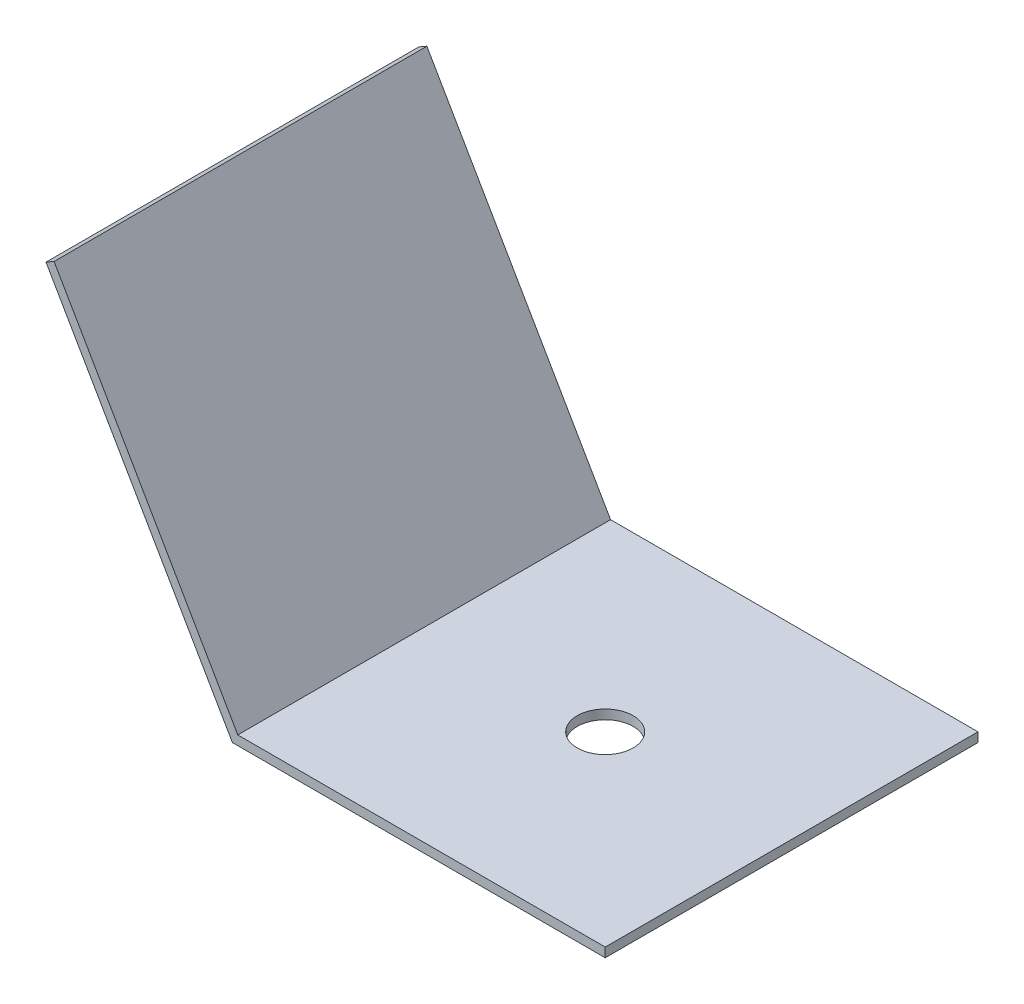
ISO-10303-21;
HEADER;
FILE_DESCRIPTION(('STEP AP214'),'2;1');
FILE_NAME('part.step','',(''),(''),'','','');
FILE_SCHEMA(('AUTOMOTIVE_DESIGN { 1 0 10303 214 1 1 1 1 }'));
ENDSEC;
DATA;
#1=APPLICATION_CONTEXT('core data for automotive mechanical design processes');
#2=APPLICATION_PROTOCOL_DEFINITION('international standard','automotive_design',2000,#1);
#3=PRODUCT_CONTEXT('',#1,'mechanical');
#4=PRODUCT('Part','Part','',(#3));
#5=PRODUCT_RELATED_PRODUCT_CATEGORY('part','',(#4));
#6=PRODUCT_DEFINITION_FORMATION('','',#4);
#7=PRODUCT_DEFINITION_CONTEXT('part definition',#1,'design');
#8=PRODUCT_DEFINITION('design','',#6,#7);
#9=PRODUCT_DEFINITION_SHAPE('','',#8);
#10=(LENGTH_UNIT() NAMED_UNIT(*) SI_UNIT(.MILLI.,.METRE.));
#11=(NAMED_UNIT(*) PLANE_ANGLE_UNIT() SI_UNIT($,.RADIAN.));
#12=(NAMED_UNIT(*) SI_UNIT($,.STERADIAN.) SOLID_ANGLE_UNIT());
#13=UNCERTAINTY_MEASURE_WITH_UNIT(LENGTH_MEASURE(1.E-05),#10,'distance_accuracy_value','');
#14=(GEOMETRIC_REPRESENTATION_CONTEXT(3) GLOBAL_UNCERTAINTY_ASSIGNED_CONTEXT((#13)) GLOBAL_UNIT_ASSIGNED_CONTEXT((#10,
#11,#12)) REPRESENTATION_CONTEXT('',''));
#15=CARTESIAN_POINT('',(0.,0.,0.));
#16=DIRECTION('',(0.,0.,1.));
#17=DIRECTION('',(1.,0.,0.));
#18=AXIS2_PLACEMENT_3D('',#15,#16,#17);
#19=CARTESIAN_POINT('',(0.,1.,0.));
#20=DIRECTION('',(0.,-1.,0.));
#21=DIRECTION('',(0.,0.,-1.));
#22=AXIS2_PLACEMENT_3D('',#19,#20,#21);
#23=PLANE('',#22);
#24=CARTESIAN_POINT('',(0.,1.,0.));
#25=DIRECTION('',(0.,1.,0.));
#26=DIRECTION('',(0.,0.,1.));
#27=AXIS2_PLACEMENT_3D('',#24,#25,#26);
#28=CIRCLE('',#27,3.);
#29=CARTESIAN_POINT('',(0.,1.,3.));
#30=VERTEX_POINT('',#29);
#31=EDGE_CURVE('E116',#30,#30,#28,.T.);
#32=ORIENTED_EDGE('',*,*,#31,.F.);
#33=EDGE_LOOP('',(#32));
#34=FACE_BOUND('',#33,.T.);
#35=DIRECTION('',(0.,0.,-1.));
#36=VECTOR('',#35,1.);
#37=CARTESIAN_POINT('',(-19.4226497308104,1.,0.));
#38=LINE('',#37,#36);
#39=CARTESIAN_POINT('',(-19.4226497308104,1.,20.));
#40=VERTEX_POINT('',#39);
#41=CARTESIAN_POINT('',(-19.4226497308104,1.,-20.));
#42=VERTEX_POINT('',#41);
#43=EDGE_CURVE('E52',#40,#42,#38,.T.);
#44=ORIENTED_EDGE('',*,*,#43,.F.);
#45=DIRECTION('',(1.,0.,0.));
#46=VECTOR('',#45,1.);
#47=CARTESIAN_POINT('',(20.,1.,20.));
#48=LINE('',#47,#46);
#49=CARTESIAN_POINT('',(20.,1.,20.));
#50=VERTEX_POINT('',#49);
#51=EDGE_CURVE('E122',#40,#50,#48,.T.);
#52=ORIENTED_EDGE('',*,*,#51,.T.);
#53=DIRECTION('',(0.,0.,-1.));
#54=VECTOR('',#53,1.);
#55=CARTESIAN_POINT('',(20.,1.,-20.));
#56=LINE('',#55,#54);
#57=CARTESIAN_POINT('',(20.,1.,-20.));
#58=VERTEX_POINT('',#57);
#59=EDGE_CURVE('E124',#50,#58,#56,.T.);
#60=ORIENTED_EDGE('',*,*,#59,.T.);
#61=DIRECTION('',(-1.,0.,0.));
#62=VECTOR('',#61,1.);
#63=CARTESIAN_POINT('',(20.,1.,-20.));
#64=LINE('',#63,#62);
#65=EDGE_CURVE('E57',#58,#42,#64,.T.);
#66=ORIENTED_EDGE('',*,*,#65,.T.);
#67=EDGE_LOOP('',(#44,#52,#60,#66));
#68=FACE_BOUND('',#67,.T.);
#69=ADVANCED_FACE('F37',(#34,#68),#23,.F.);
#70=CARTESIAN_POINT('',(0.,0.,0.));
#71=DIRECTION('',(0.,-1.,0.));
#72=DIRECTION('',(0.,0.,-1.));
#73=AXIS2_PLACEMENT_3D('',#70,#71,#72);
#74=PLANE('',#73);
#75=DIRECTION('',(0.,0.,1.));
#76=VECTOR('',#75,1.);
#77=CARTESIAN_POINT('',(-20.,0.,-20.));
#78=LINE('',#77,#76);
#79=CARTESIAN_POINT('',(-20.,0.,-20.));
#80=VERTEX_POINT('',#79);
#81=CARTESIAN_POINT('',(-20.,0.,20.));
#82=VERTEX_POINT('',#81);
#83=EDGE_CURVE('E119',#80,#82,#78,.T.);
#84=ORIENTED_EDGE('',*,*,#83,.F.);
#85=DIRECTION('',(-1.,0.,0.));
#86=VECTOR('',#85,1.);
#87=CARTESIAN_POINT('',(20.,0.,-20.));
#88=LINE('',#87,#86);
#89=CARTESIAN_POINT('',(20.,0.,-20.));
#90=VERTEX_POINT('',#89);
#91=EDGE_CURVE('E125',#90,#80,#88,.T.);
#92=ORIENTED_EDGE('',*,*,#91,.F.);
#93=DIRECTION('',(0.,0.,-1.));
#94=VECTOR('',#93,1.);
#95=CARTESIAN_POINT('',(20.,0.,-20.));
#96=LINE('',#95,#94);
#97=CARTESIAN_POINT('',(20.,0.,20.));
#98=VERTEX_POINT('',#97);
#99=EDGE_CURVE('E132',#98,#90,#96,.T.);
#100=ORIENTED_EDGE('',*,*,#99,.F.);
#101=DIRECTION('',(1.,0.,0.));
#102=VECTOR('',#101,1.);
#103=CARTESIAN_POINT('',(20.,0.,20.));
#104=LINE('',#103,#102);
#105=EDGE_CURVE('E130',#82,#98,#104,.T.);
#106=ORIENTED_EDGE('',*,*,#105,.F.);
#107=EDGE_LOOP('',(#84,#92,#100,#106));
#108=FACE_BOUND('',#107,.T.);
#109=CARTESIAN_POINT('',(0.,0.,0.));
#110=DIRECTION('',(0.,1.,0.));
#111=DIRECTION('',(0.,0.,1.));
#112=AXIS2_PLACEMENT_3D('',#109,#110,#111);
#113=CIRCLE('',#112,3.);
#114=CARTESIAN_POINT('',(0.,0.,3.));
#115=VERTEX_POINT('',#114);
#116=EDGE_CURVE('E111',#115,#115,#113,.T.);
#117=ORIENTED_EDGE('',*,*,#116,.T.);
#118=EDGE_LOOP('',(#117));
#119=FACE_BOUND('',#118,.T.);
#120=ADVANCED_FACE('F142',(#108,#119),#74,.T.);
#121=CARTESIAN_POINT('',(20.,1.,20.));
#122=DIRECTION('',(0.,0.,-1.));
#123=DIRECTION('',(-1.,0.,0.));
#124=AXIS2_PLACEMENT_3D('',#121,#122,#123);
#125=PLANE('',#124);
#126=ORIENTED_EDGE('',*,*,#51,.F.);
#127=DIRECTION('',(0.500000000000007,-0.866025403784434,0.));
#128=VECTOR('',#127,1.);
#129=CARTESIAN_POINT('',(-19.1339745962156,0.500000000000007,20.));
#130=LINE('',#129,#128);
#131=CARTESIAN_POINT('',(-39.1339745962159,35.1410161513774,20.));
#132=VERTEX_POINT('',#131);
#133=EDGE_CURVE('E105',#132,#40,#130,.T.);
#134=ORIENTED_EDGE('',*,*,#133,.F.);
#135=DIRECTION('',(-0.866025403784435,-0.500000000000007,0.));
#136=VECTOR('',#135,1.);
#137=CARTESIAN_POINT('',(-39.1339745962159,35.1410161513774,20.));
#138=LINE('',#137,#136);
#139=CARTESIAN_POINT('',(-40.0000000000003,34.6410161513774,20.));
#140=VERTEX_POINT('',#139);
#141=EDGE_CURVE('E103',#132,#140,#138,.T.);
#142=ORIENTED_EDGE('',*,*,#141,.T.);
#143=DIRECTION('',(0.500000000000007,-0.866025403784434,0.));
#144=VECTOR('',#143,1.);
#145=CARTESIAN_POINT('',(-20.,0.,20.));
#146=LINE('',#145,#144);
#147=EDGE_CURVE('E95',#140,#82,#146,.T.);
#148=ORIENTED_EDGE('',*,*,#147,.T.);
#149=ORIENTED_EDGE('',*,*,#105,.T.);
#150=DIRECTION('',(0.,-1.,0.));
#151=VECTOR('',#150,1.);
#152=CARTESIAN_POINT('',(20.,1.,20.));
#153=LINE('',#152,#151);
#154=EDGE_CURVE('E11',#50,#98,#153,.T.);
#155=ORIENTED_EDGE('',*,*,#154,.F.);
#156=EDGE_LOOP('',(#126,#134,#142,#148,#149,#155));
#157=FACE_BOUND('',#156,.T.);
#158=ADVANCED_FACE('F39',(#157),#125,.F.);
#159=CARTESIAN_POINT('',(20.,1.,-20.));
#160=DIRECTION('',(-1.,0.,0.));
#161=DIRECTION('',(0.,0.,1.));
#162=AXIS2_PLACEMENT_3D('',#159,#160,#161);
#163=PLANE('',#162);
#164=ORIENTED_EDGE('',*,*,#99,.T.);
#165=DIRECTION('',(0.,-1.,0.));
#166=VECTOR('',#165,1.);
#167=CARTESIAN_POINT('',(20.,1.,-20.));
#168=LINE('',#167,#166);
#169=EDGE_CURVE('E45',#58,#90,#168,.T.);
#170=ORIENTED_EDGE('',*,*,#169,.F.);
#171=ORIENTED_EDGE('',*,*,#59,.F.);
#172=ORIENTED_EDGE('',*,*,#154,.T.);
#173=EDGE_LOOP('',(#164,#170,#171,#172));
#174=FACE_BOUND('',#173,.T.);
#175=ADVANCED_FACE('F154',(#174),#163,.F.);
#176=CARTESIAN_POINT('',(20.,1.,-20.));
#177=DIRECTION('',(0.,0.,1.));
#178=DIRECTION('',(1.,0.,0.));
#179=AXIS2_PLACEMENT_3D('',#176,#177,#178);
#180=PLANE('',#179);
#181=ORIENTED_EDGE('',*,*,#91,.T.);
#182=DIRECTION('',(-0.500000000000007,0.866025403784434,0.));
#183=VECTOR('',#182,1.);
#184=CARTESIAN_POINT('',(-40.0000000000003,34.6410161513774,-20.));
#185=LINE('',#184,#183);
#186=CARTESIAN_POINT('',(-40.0000000000003,34.6410161513774,-20.));
#187=VERTEX_POINT('',#186);
#188=EDGE_CURVE('E109',#80,#187,#185,.T.);
#189=ORIENTED_EDGE('',*,*,#188,.T.);
#190=DIRECTION('',(-0.866025403784435,-0.500000000000007,0.));
#191=VECTOR('',#190,1.);
#192=CARTESIAN_POINT('',(-39.1339745962159,35.1410161513774,-20.));
#193=LINE('',#192,#191);
#194=CARTESIAN_POINT('',(-39.1339745962159,35.1410161513774,-20.));
#195=VERTEX_POINT('',#194);
#196=EDGE_CURVE('E100',#195,#187,#193,.T.);
#197=ORIENTED_EDGE('',*,*,#196,.F.);
#198=DIRECTION('',(-0.500000000000007,0.866025403784434,0.));
#199=VECTOR('',#198,1.);
#200=CARTESIAN_POINT('',(-39.1339745962159,35.1410161513774,-20.));
#201=LINE('',#200,#199);
#202=EDGE_CURVE('E87',#42,#195,#201,.T.);
#203=ORIENTED_EDGE('',*,*,#202,.F.);
#204=ORIENTED_EDGE('',*,*,#65,.F.);
#205=ORIENTED_EDGE('',*,*,#169,.T.);
#206=EDGE_LOOP('',(#181,#189,#197,#203,#204,#205));
#207=FACE_BOUND('',#206,.T.);
#208=ADVANCED_FACE('F107',(#207),#180,.F.);
#209=CARTESIAN_POINT('',(0.,1.,0.));
#210=DIRECTION('',(0.,-1.,0.));
#211=DIRECTION('',(0.,0.,-1.));
#212=AXIS2_PLACEMENT_3D('',#209,#210,#211);
#213=CYLINDRICAL_SURFACE('',#212,3.);
#214=ORIENTED_EDGE('',*,*,#31,.T.);
#215=EDGE_LOOP('',(#214));
#216=FACE_BOUND('',#215,.T.);
#217=ORIENTED_EDGE('',*,*,#116,.F.);
#218=EDGE_LOOP('',(#217));
#219=FACE_BOUND('',#218,.T.);
#220=ADVANCED_FACE('F160',(#216,#219),#213,.F.);
#221=CARTESIAN_POINT('',(-14.1339745962154,-8.16025403784447,0.));
#222=DIRECTION('',(-0.866025403784435,-0.500000000000007,0.));
#223=DIRECTION('',(0.500000000000007,-0.866025403784434,0.));
#224=AXIS2_PLACEMENT_3D('',#221,#222,#223);
#225=PLANE('',#224);
#226=ORIENTED_EDGE('',*,*,#133,.T.);
#227=ORIENTED_EDGE('',*,*,#43,.T.);
#228=ORIENTED_EDGE('',*,*,#202,.T.);
#229=DIRECTION('',(0.,0.,1.));
#230=VECTOR('',#229,1.);
#231=CARTESIAN_POINT('',(-39.1339745962159,35.1410161513774,20.));
#232=LINE('',#231,#230);
#233=EDGE_CURVE('E91',#195,#132,#232,.T.);
#234=ORIENTED_EDGE('',*,*,#233,.T.);
#235=EDGE_LOOP('',(#226,#227,#228,#234));
#236=FACE_BOUND('',#235,.T.);
#237=ADVANCED_FACE('F90',(#236),#225,.F.);
#238=CARTESIAN_POINT('',(-39.1339745962159,35.1410161513774,20.));
#239=DIRECTION('',(0.500000000000007,-0.866025403784435,0.));
#240=DIRECTION('',(0.866025403784435,0.500000000000007,0.));
#241=AXIS2_PLACEMENT_3D('',#238,#239,#240);
#242=PLANE('',#241);
#243=DIRECTION('',(0.,0.,1.));
#244=VECTOR('',#243,1.);
#245=CARTESIAN_POINT('',(-40.0000000000003,34.6410161513774,20.));
#246=LINE('',#245,#244);
#247=EDGE_CURVE('E148',#187,#140,#246,.T.);
#248=ORIENTED_EDGE('',*,*,#247,.T.);
#249=ORIENTED_EDGE('',*,*,#141,.F.);
#250=ORIENTED_EDGE('',*,*,#233,.F.);
#251=ORIENTED_EDGE('',*,*,#196,.T.);
#252=EDGE_LOOP('',(#248,#249,#250,#251));
#253=FACE_BOUND('',#252,.T.);
#254=ADVANCED_FACE('F99',(#253),#242,.F.);
#255=CARTESIAN_POINT('',(-14.9999999999999,-8.66025403784447,0.));
#256=DIRECTION('',(-0.866025403784435,-0.500000000000007,0.));
#257=DIRECTION('',(0.500000000000007,-0.866025403784434,0.));
#258=AXIS2_PLACEMENT_3D('',#255,#256,#257);
#259=PLANE('',#258);
#260=ORIENTED_EDGE('',*,*,#188,.F.);
#261=ORIENTED_EDGE('',*,*,#83,.T.);
#262=ORIENTED_EDGE('',*,*,#147,.F.);
#263=ORIENTED_EDGE('',*,*,#247,.F.);
#264=EDGE_LOOP('',(#260,#261,#262,#263));
#265=FACE_BOUND('',#264,.T.);
#266=ADVANCED_FACE('F147',(#265),#259,.T.);
#267=CLOSED_SHELL('',(#69,#120,#158,#175,#208,#220,#237,#254,#266));
#268=MANIFOLD_SOLID_BREP('B2',#267);
#269=ADVANCED_BREP_SHAPE_REPRESENTATION('',(#18,#268),#14);
#270=SHAPE_DEFINITION_REPRESENTATION(#9,#269);
ENDSEC;
END-ISO-10303-21;
